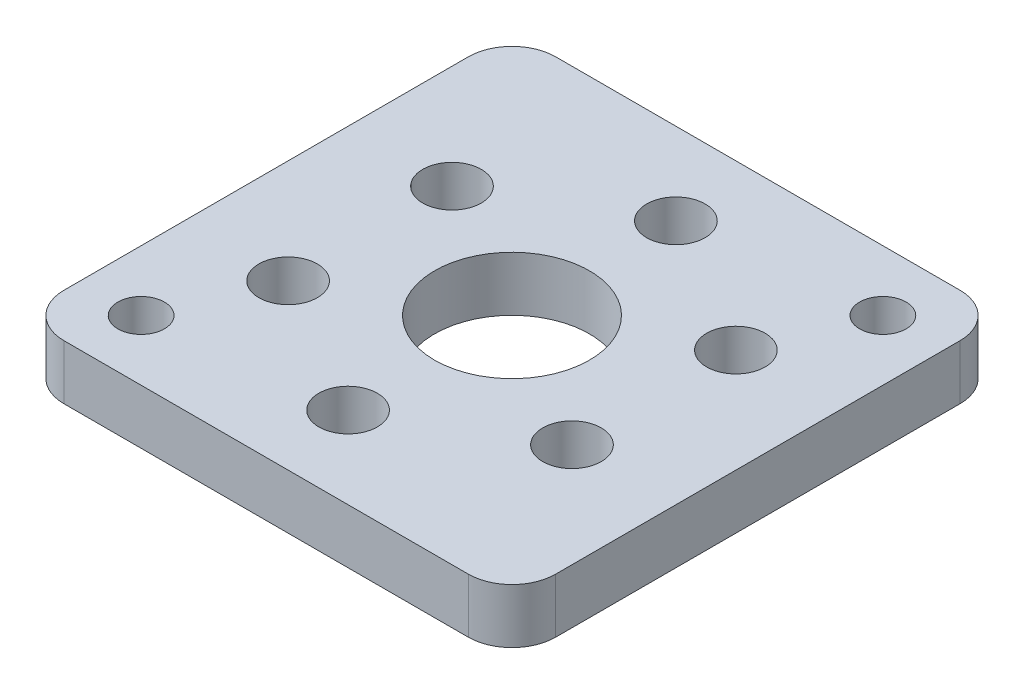
ISO-10303-21;
HEADER;
FILE_DESCRIPTION(('STEP AP214'),'2;1');
FILE_NAME('part.step','',(''),(''),'','','');
FILE_SCHEMA(('AUTOMOTIVE_DESIGN { 1 0 10303 214 1 1 1 1 }'));
ENDSEC;
DATA;
#1=APPLICATION_CONTEXT('core data for automotive mechanical design processes');
#2=APPLICATION_PROTOCOL_DEFINITION('international standard','automotive_design',2000,#1);
#3=PRODUCT_CONTEXT('',#1,'mechanical');
#4=PRODUCT('Part','Part','',(#3));
#5=PRODUCT_RELATED_PRODUCT_CATEGORY('part','',(#4));
#6=PRODUCT_DEFINITION_FORMATION('','',#4);
#7=PRODUCT_DEFINITION_CONTEXT('part definition',#1,'design');
#8=PRODUCT_DEFINITION('design','',#6,#7);
#9=PRODUCT_DEFINITION_SHAPE('','',#8);
#10=(LENGTH_UNIT() NAMED_UNIT(*) SI_UNIT(.MILLI.,.METRE.));
#11=(NAMED_UNIT(*) PLANE_ANGLE_UNIT() SI_UNIT($,.RADIAN.));
#12=(NAMED_UNIT(*) SI_UNIT($,.STERADIAN.) SOLID_ANGLE_UNIT());
#13=UNCERTAINTY_MEASURE_WITH_UNIT(LENGTH_MEASURE(1.E-05),#10,'distance_accuracy_value','');
#14=(GEOMETRIC_REPRESENTATION_CONTEXT(3) GLOBAL_UNCERTAINTY_ASSIGNED_CONTEXT((#13)) GLOBAL_UNIT_ASSIGNED_CONTEXT((#10,
#11,#12)) REPRESENTATION_CONTEXT('',''));
#15=CARTESIAN_POINT('',(0.,0.,0.));
#16=DIRECTION('',(0.,0.,1.));
#17=DIRECTION('',(1.,0.,0.));
#18=AXIS2_PLACEMENT_3D('',#15,#16,#17);
#19=CARTESIAN_POINT('',(0.,3.175,0.));
#20=DIRECTION('',(0.,-1.,0.));
#21=DIRECTION('',(0.,0.,-1.));
#22=AXIS2_PLACEMENT_3D('',#19,#20,#21);
#23=PLANE('',#22);
#24=CARTESIAN_POINT('',(10.776307345283,3.175,-10.776307345283));
#25=DIRECTION('',(0.,1.,0.));
#26=DIRECTION('',(0.,0.,1.));
#27=AXIS2_PLACEMENT_3D('',#24,#25,#26);
#28=CIRCLE('',#27,1.35255);
#29=CARTESIAN_POINT('',(10.776307345283,3.175,-9.42375734528301));
#30=VERTEX_POINT('',#29);
#31=EDGE_CURVE('E240',#30,#30,#28,.T.);
#32=ORIENTED_EDGE('',*,*,#31,.F.);
#33=EDGE_LOOP('',(#32));
#34=FACE_BOUND('',#33,.T.);
#35=CARTESIAN_POINT('',(-10.776307345283,3.175,10.776307345283));
#36=DIRECTION('',(0.,1.,0.));
#37=DIRECTION('',(0.,0.,1.));
#38=AXIS2_PLACEMENT_3D('',#35,#36,#37);
#39=CIRCLE('',#38,1.35255);
#40=CARTESIAN_POINT('',(-10.776307345283,3.175,12.128857345283));
#41=VERTEX_POINT('',#40);
#42=EDGE_CURVE('E234',#41,#41,#39,.T.);
#43=ORIENTED_EDGE('',*,*,#42,.F.);
#44=EDGE_LOOP('',(#43));
#45=FACE_BOUND('',#44,.T.);
#46=CARTESIAN_POINT('',(8.24889197104672,3.175,-4.7625000000001));
#47=DIRECTION('',(0.,1.,0.));
#48=DIRECTION('',(0.,0.,1.));
#49=AXIS2_PLACEMENT_3D('',#46,#47,#48);
#50=CIRCLE('',#49,1.7);
#51=CARTESIAN_POINT('',(8.24889197104672,3.175,-3.0625000000001));
#52=VERTEX_POINT('',#51);
#53=EDGE_CURVE('E228',#52,#52,#50,.T.);
#54=ORIENTED_EDGE('',*,*,#53,.F.);
#55=EDGE_LOOP('',(#54));
#56=FACE_BOUND('',#55,.T.);
#57=CARTESIAN_POINT('',(8.24889197104682,3.175,4.76249999999992));
#58=DIRECTION('',(0.,1.,0.));
#59=DIRECTION('',(0.,0.,1.));
#60=AXIS2_PLACEMENT_3D('',#57,#58,#59);
#61=CIRCLE('',#60,1.7);
#62=CARTESIAN_POINT('',(8.24889197104682,3.175,6.46249999999992));
#63=VERTEX_POINT('',#62);
#64=EDGE_CURVE('E222',#63,#63,#61,.T.);
#65=ORIENTED_EDGE('',*,*,#64,.F.);
#66=EDGE_LOOP('',(#65));
#67=FACE_BOUND('',#66,.T.);
#68=CARTESIAN_POINT('',(0.,3.175,9.525));
#69=DIRECTION('',(0.,1.,0.));
#70=DIRECTION('',(0.,0.,1.));
#71=AXIS2_PLACEMENT_3D('',#68,#69,#70);
#72=CIRCLE('',#71,1.7);
#73=CARTESIAN_POINT('',(0.,3.175,11.225));
#74=VERTEX_POINT('',#73);
#75=EDGE_CURVE('E216',#74,#74,#72,.T.);
#76=ORIENTED_EDGE('',*,*,#75,.F.);
#77=EDGE_LOOP('',(#76));
#78=FACE_BOUND('',#77,.T.);
#79=CARTESIAN_POINT('',(-8.24889197104679,3.175,-4.76249999999998));
#80=DIRECTION('',(0.,1.,0.));
#81=DIRECTION('',(0.,0.,1.));
#82=AXIS2_PLACEMENT_3D('',#79,#80,#81);
#83=CIRCLE('',#82,1.7);
#84=CARTESIAN_POINT('',(-8.24889197104679,3.175,-3.06249999999998));
#85=VERTEX_POINT('',#84);
#86=EDGE_CURVE('E204',#85,#85,#83,.T.);
#87=ORIENTED_EDGE('',*,*,#86,.F.);
#88=EDGE_LOOP('',(#87));
#89=FACE_BOUND('',#88,.T.);
#90=CARTESIAN_POINT('',(0.,3.175,0.));
#91=DIRECTION('',(0.,1.,0.));
#92=DIRECTION('',(0.,0.,1.));
#93=AXIS2_PLACEMENT_3D('',#90,#91,#92);
#94=CIRCLE('',#93,4.5);
#95=CARTESIAN_POINT('',(0.,3.175,4.5));
#96=VERTEX_POINT('',#95);
#97=EDGE_CURVE('E196',#96,#96,#94,.T.);
#98=ORIENTED_EDGE('',*,*,#97,.F.);
#99=EDGE_LOOP('',(#98));
#100=FACE_BOUND('',#99,.T.);
#101=CARTESIAN_POINT('',(0.,3.175,-9.525));
#102=DIRECTION('',(0.,1.,0.));
#103=DIRECTION('',(0.,0.,1.));
#104=AXIS2_PLACEMENT_3D('',#101,#102,#103);
#105=CIRCLE('',#104,1.7);
#106=CARTESIAN_POINT('',(0.,3.175,-7.825));
#107=VERTEX_POINT('',#106);
#108=EDGE_CURVE('E192',#107,#107,#105,.T.);
#109=ORIENTED_EDGE('',*,*,#108,.F.);
#110=EDGE_LOOP('',(#109));
#111=FACE_BOUND('',#110,.T.);
#112=DIRECTION('',(0.,0.,-1.));
#113=VECTOR('',#112,1.);
#114=CARTESIAN_POINT('',(14.2875,3.175,14.2875));
#115=LINE('',#114,#113);
#116=CARTESIAN_POINT('',(14.2875,3.175,11.7475));
#117=VERTEX_POINT('',#116);
#118=CARTESIAN_POINT('',(14.2875,3.175,-11.7475));
#119=VERTEX_POINT('',#118);
#120=EDGE_CURVE('E147',#117,#119,#115,.T.);
#121=ORIENTED_EDGE('',*,*,#120,.T.);
#122=CARTESIAN_POINT('',(11.7475,3.175,-11.7475));
#123=DIRECTION('',(0.,-1.,0.));
#124=DIRECTION('',(0.,0.,-1.));
#125=AXIS2_PLACEMENT_3D('',#122,#123,#124);
#126=CIRCLE('',#125,2.54);
#127=CARTESIAN_POINT('',(11.7475,3.175,-14.2875));
#128=VERTEX_POINT('',#127);
#129=EDGE_CURVE('E161',#119,#128,#126,.F.);
#130=ORIENTED_EDGE('',*,*,#129,.T.);
#131=DIRECTION('',(-1.,0.,0.));
#132=VECTOR('',#131,1.);
#133=CARTESIAN_POINT('',(-14.2875,3.175,-14.2875));
#134=LINE('',#133,#132);
#135=CARTESIAN_POINT('',(-11.7475,3.175,-14.2875));
#136=VERTEX_POINT('',#135);
#137=EDGE_CURVE('E128',#128,#136,#134,.T.);
#138=ORIENTED_EDGE('',*,*,#137,.T.);
#139=CARTESIAN_POINT('',(-11.7475,3.175,-11.7475));
#140=DIRECTION('',(0.,-1.,0.));
#141=DIRECTION('',(0.,0.,-1.));
#142=AXIS2_PLACEMENT_3D('',#139,#140,#141);
#143=CIRCLE('',#142,2.54);
#144=CARTESIAN_POINT('',(-14.2875,3.175,-11.7475));
#145=VERTEX_POINT('',#144);
#146=EDGE_CURVE('E157',#136,#145,#143,.F.);
#147=ORIENTED_EDGE('',*,*,#146,.T.);
#148=DIRECTION('',(0.,0.,1.));
#149=VECTOR('',#148,1.);
#150=CARTESIAN_POINT('',(-14.2875,3.175,14.2875));
#151=LINE('',#150,#149);
#152=CARTESIAN_POINT('',(-14.2875,3.175,11.7475));
#153=VERTEX_POINT('',#152);
#154=EDGE_CURVE('E170',#145,#153,#151,.T.);
#155=ORIENTED_EDGE('',*,*,#154,.T.);
#156=CARTESIAN_POINT('',(-11.7475,3.175,11.7475));
#157=DIRECTION('',(0.,-1.,0.));
#158=DIRECTION('',(0.,0.,-1.));
#159=AXIS2_PLACEMENT_3D('',#156,#157,#158);
#160=CIRCLE('',#159,2.54);
#161=CARTESIAN_POINT('',(-11.7475,3.175,14.2875));
#162=VERTEX_POINT('',#161);
#163=EDGE_CURVE('E63',#153,#162,#160,.F.);
#164=ORIENTED_EDGE('',*,*,#163,.T.);
#165=DIRECTION('',(1.,0.,0.));
#166=VECTOR('',#165,1.);
#167=CARTESIAN_POINT('',(-14.2875,3.175,14.2875));
#168=LINE('',#167,#166);
#169=CARTESIAN_POINT('',(11.7475,3.175,14.2875));
#170=VERTEX_POINT('',#169);
#171=EDGE_CURVE('E148',#162,#170,#168,.T.);
#172=ORIENTED_EDGE('',*,*,#171,.T.);
#173=CARTESIAN_POINT('',(11.7475,3.175,11.7475));
#174=DIRECTION('',(0.,-1.,0.));
#175=DIRECTION('',(0.,0.,-1.));
#176=AXIS2_PLACEMENT_3D('',#173,#174,#175);
#177=CIRCLE('',#176,2.54);
#178=EDGE_CURVE('E159',#170,#117,#177,.F.);
#179=ORIENTED_EDGE('',*,*,#178,.T.);
#180=EDGE_LOOP('',(#121,#130,#138,#147,#155,#164,#172,#179));
#181=FACE_BOUND('',#180,.T.);
#182=CARTESIAN_POINT('',(-8.24889197104676,3.175,4.76250000000004));
#183=DIRECTION('',(0.,1.,0.));
#184=DIRECTION('',(0.,0.,1.));
#185=AXIS2_PLACEMENT_3D('',#182,#183,#184);
#186=CIRCLE('',#185,1.7);
#187=CARTESIAN_POINT('',(-8.24889197104676,3.175,6.46250000000004));
#188=VERTEX_POINT('',#187);
#189=EDGE_CURVE('E210',#188,#188,#186,.T.);
#190=ORIENTED_EDGE('',*,*,#189,.F.);
#191=EDGE_LOOP('',(#190));
#192=FACE_BOUND('',#191,.T.);
#193=ADVANCED_FACE('F41',(#34,#45,#56,#67,#78,#89,#100,#111,#181,#192),#23,.F.);
#194=CARTESIAN_POINT('',(0.,0.,0.));
#195=DIRECTION('',(0.,-1.,0.));
#196=DIRECTION('',(0.,0.,-1.));
#197=AXIS2_PLACEMENT_3D('',#194,#195,#196);
#198=PLANE('',#197);
#199=CARTESIAN_POINT('',(10.776307345283,0.,-10.776307345283));
#200=DIRECTION('',(0.,1.,0.));
#201=DIRECTION('',(0.,0.,1.));
#202=AXIS2_PLACEMENT_3D('',#199,#200,#201);
#203=CIRCLE('',#202,1.35255);
#204=CARTESIAN_POINT('',(10.776307345283,0.,-9.42375734528301));
#205=VERTEX_POINT('',#204);
#206=EDGE_CURVE('E237',#205,#205,#203,.T.);
#207=ORIENTED_EDGE('',*,*,#206,.T.);
#208=EDGE_LOOP('',(#207));
#209=FACE_BOUND('',#208,.T.);
#210=CARTESIAN_POINT('',(-10.776307345283,0.,10.776307345283));
#211=DIRECTION('',(0.,1.,0.));
#212=DIRECTION('',(0.,0.,1.));
#213=AXIS2_PLACEMENT_3D('',#210,#211,#212);
#214=CIRCLE('',#213,1.35255);
#215=CARTESIAN_POINT('',(-10.776307345283,0.,12.128857345283));
#216=VERTEX_POINT('',#215);
#217=EDGE_CURVE('E231',#216,#216,#214,.T.);
#218=ORIENTED_EDGE('',*,*,#217,.T.);
#219=EDGE_LOOP('',(#218));
#220=FACE_BOUND('',#219,.T.);
#221=CARTESIAN_POINT('',(8.24889197104672,0.,-4.7625000000001));
#222=DIRECTION('',(0.,1.,0.));
#223=DIRECTION('',(0.,0.,1.));
#224=AXIS2_PLACEMENT_3D('',#221,#222,#223);
#225=CIRCLE('',#224,1.7);
#226=CARTESIAN_POINT('',(8.24889197104672,0.,-3.0625000000001));
#227=VERTEX_POINT('',#226);
#228=EDGE_CURVE('E225',#227,#227,#225,.T.);
#229=ORIENTED_EDGE('',*,*,#228,.T.);
#230=EDGE_LOOP('',(#229));
#231=FACE_BOUND('',#230,.T.);
#232=CARTESIAN_POINT('',(8.24889197104682,0.,4.76249999999992));
#233=DIRECTION('',(0.,1.,0.));
#234=DIRECTION('',(0.,0.,1.));
#235=AXIS2_PLACEMENT_3D('',#232,#233,#234);
#236=CIRCLE('',#235,1.7);
#237=CARTESIAN_POINT('',(8.24889197104682,0.,6.46249999999992));
#238=VERTEX_POINT('',#237);
#239=EDGE_CURVE('E219',#238,#238,#236,.T.);
#240=ORIENTED_EDGE('',*,*,#239,.T.);
#241=EDGE_LOOP('',(#240));
#242=FACE_BOUND('',#241,.T.);
#243=CARTESIAN_POINT('',(0.,0.,9.525));
#244=DIRECTION('',(0.,1.,0.));
#245=DIRECTION('',(0.,0.,1.));
#246=AXIS2_PLACEMENT_3D('',#243,#244,#245);
#247=CIRCLE('',#246,1.7);
#248=CARTESIAN_POINT('',(0.,0.,11.225));
#249=VERTEX_POINT('',#248);
#250=EDGE_CURVE('E213',#249,#249,#247,.T.);
#251=ORIENTED_EDGE('',*,*,#250,.T.);
#252=EDGE_LOOP('',(#251));
#253=FACE_BOUND('',#252,.T.);
#254=CARTESIAN_POINT('',(-8.24889197104676,0.,4.76250000000004));
#255=DIRECTION('',(0.,1.,0.));
#256=DIRECTION('',(0.,0.,1.));
#257=AXIS2_PLACEMENT_3D('',#254,#255,#256);
#258=CIRCLE('',#257,1.7);
#259=CARTESIAN_POINT('',(-8.24889197104676,0.,6.46250000000004));
#260=VERTEX_POINT('',#259);
#261=EDGE_CURVE('E207',#260,#260,#258,.T.);
#262=ORIENTED_EDGE('',*,*,#261,.T.);
#263=EDGE_LOOP('',(#262));
#264=FACE_BOUND('',#263,.T.);
#265=CARTESIAN_POINT('',(-8.24889197104679,0.,-4.76249999999998));
#266=DIRECTION('',(0.,1.,0.));
#267=DIRECTION('',(0.,0.,1.));
#268=AXIS2_PLACEMENT_3D('',#265,#266,#267);
#269=CIRCLE('',#268,1.7);
#270=CARTESIAN_POINT('',(-8.24889197104679,0.,-3.06249999999998));
#271=VERTEX_POINT('',#270);
#272=EDGE_CURVE('E199',#271,#271,#269,.T.);
#273=ORIENTED_EDGE('',*,*,#272,.T.);
#274=EDGE_LOOP('',(#273));
#275=FACE_BOUND('',#274,.T.);
#276=CARTESIAN_POINT('',(0.,0.,0.));
#277=DIRECTION('',(0.,1.,0.));
#278=DIRECTION('',(0.,0.,1.));
#279=AXIS2_PLACEMENT_3D('',#276,#277,#278);
#280=CIRCLE('',#279,4.5);
#281=CARTESIAN_POINT('',(0.,0.,4.5));
#282=VERTEX_POINT('',#281);
#283=EDGE_CURVE('E195',#282,#282,#280,.T.);
#284=ORIENTED_EDGE('',*,*,#283,.T.);
#285=EDGE_LOOP('',(#284));
#286=FACE_BOUND('',#285,.T.);
#287=DIRECTION('',(-1.,0.,0.));
#288=VECTOR('',#287,1.);
#289=CARTESIAN_POINT('',(-14.2875,0.,-14.2875));
#290=LINE('',#289,#288);
#291=CARTESIAN_POINT('',(11.7475,0.,-14.2875));
#292=VERTEX_POINT('',#291);
#293=CARTESIAN_POINT('',(-11.7475,0.,-14.2875));
#294=VERTEX_POINT('',#293);
#295=EDGE_CURVE('E125',#292,#294,#290,.T.);
#296=ORIENTED_EDGE('',*,*,#295,.F.);
#297=CARTESIAN_POINT('',(11.7475,0.,-11.7475));
#298=DIRECTION('',(0.,-1.,0.));
#299=DIRECTION('',(0.,0.,-1.));
#300=AXIS2_PLACEMENT_3D('',#297,#298,#299);
#301=CIRCLE('',#300,2.54);
#302=CARTESIAN_POINT('',(14.2875,0.,-11.7475));
#303=VERTEX_POINT('',#302);
#304=EDGE_CURVE('E108',#292,#303,#301,.T.);
#305=ORIENTED_EDGE('',*,*,#304,.T.);
#306=DIRECTION('',(0.,0.,-1.));
#307=VECTOR('',#306,1.);
#308=CARTESIAN_POINT('',(14.2875,0.,14.2875));
#309=LINE('',#308,#307);
#310=CARTESIAN_POINT('',(14.2875,0.,11.7475));
#311=VERTEX_POINT('',#310);
#312=EDGE_CURVE('E137',#311,#303,#309,.T.);
#313=ORIENTED_EDGE('',*,*,#312,.F.);
#314=CARTESIAN_POINT('',(11.7475,0.,11.7475));
#315=DIRECTION('',(0.,-1.,0.));
#316=DIRECTION('',(0.,0.,-1.));
#317=AXIS2_PLACEMENT_3D('',#314,#315,#316);
#318=CIRCLE('',#317,2.54);
#319=CARTESIAN_POINT('',(11.7475,0.,14.2875));
#320=VERTEX_POINT('',#319);
#321=EDGE_CURVE('E119',#311,#320,#318,.T.);
#322=ORIENTED_EDGE('',*,*,#321,.T.);
#323=DIRECTION('',(1.,0.,0.));
#324=VECTOR('',#323,1.);
#325=CARTESIAN_POINT('',(-14.2875,0.,14.2875));
#326=LINE('',#325,#324);
#327=CARTESIAN_POINT('',(-11.7475,0.,14.2875));
#328=VERTEX_POINT('',#327);
#329=EDGE_CURVE('E140',#328,#320,#326,.T.);
#330=ORIENTED_EDGE('',*,*,#329,.F.);
#331=CARTESIAN_POINT('',(-11.7475,0.,11.7475));
#332=DIRECTION('',(0.,-1.,0.));
#333=DIRECTION('',(0.,0.,-1.));
#334=AXIS2_PLACEMENT_3D('',#331,#332,#333);
#335=CIRCLE('',#334,2.54);
#336=CARTESIAN_POINT('',(-14.2875,0.,11.7475));
#337=VERTEX_POINT('',#336);
#338=EDGE_CURVE('E129',#328,#337,#335,.T.);
#339=ORIENTED_EDGE('',*,*,#338,.T.);
#340=DIRECTION('',(0.,0.,1.));
#341=VECTOR('',#340,1.);
#342=CARTESIAN_POINT('',(-14.2875,0.,14.2875));
#343=LINE('',#342,#341);
#344=CARTESIAN_POINT('',(-14.2875,0.,-11.7475));
#345=VERTEX_POINT('',#344);
#346=EDGE_CURVE('E136',#345,#337,#343,.T.);
#347=ORIENTED_EDGE('',*,*,#346,.F.);
#348=CARTESIAN_POINT('',(-11.7475,0.,-11.7475));
#349=DIRECTION('',(0.,-1.,0.));
#350=DIRECTION('',(0.,0.,-1.));
#351=AXIS2_PLACEMENT_3D('',#348,#349,#350);
#352=CIRCLE('',#351,2.54);
#353=EDGE_CURVE('E135',#345,#294,#352,.T.);
#354=ORIENTED_EDGE('',*,*,#353,.T.);
#355=EDGE_LOOP('',(#296,#305,#313,#322,#330,#339,#347,#354));
#356=FACE_BOUND('',#355,.T.);
#357=CARTESIAN_POINT('',(0.,0.,-9.525));
#358=DIRECTION('',(0.,1.,0.));
#359=DIRECTION('',(0.,0.,1.));
#360=AXIS2_PLACEMENT_3D('',#357,#358,#359);
#361=CIRCLE('',#360,1.7);
#362=CARTESIAN_POINT('',(0.,0.,-7.825));
#363=VERTEX_POINT('',#362);
#364=EDGE_CURVE('E142',#363,#363,#361,.T.);
#365=ORIENTED_EDGE('',*,*,#364,.T.);
#366=EDGE_LOOP('',(#365));
#367=FACE_BOUND('',#366,.T.);
#368=ADVANCED_FACE('F132',(#209,#220,#231,#242,#253,#264,#275,#286,#356,#367),#198,.T.);
#369=CARTESIAN_POINT('',(14.2875,3.175,14.2875));
#370=DIRECTION('',(-1.,0.,0.));
#371=DIRECTION('',(0.,0.,1.));
#372=AXIS2_PLACEMENT_3D('',#369,#370,#371);
#373=PLANE('',#372);
#374=ORIENTED_EDGE('',*,*,#312,.T.);
#375=DIRECTION('',(0.,-1.,0.));
#376=VECTOR('',#375,1.);
#377=CARTESIAN_POINT('',(14.2875,3.175,-11.7475));
#378=LINE('',#377,#376);
#379=EDGE_CURVE('E113',#303,#119,#378,.F.);
#380=ORIENTED_EDGE('',*,*,#379,.T.);
#381=ORIENTED_EDGE('',*,*,#120,.F.);
#382=DIRECTION('',(0.,-1.,0.));
#383=VECTOR('',#382,1.);
#384=CARTESIAN_POINT('',(14.2875,3.175,11.7475));
#385=LINE('',#384,#383);
#386=EDGE_CURVE('E118',#117,#311,#385,.T.);
#387=ORIENTED_EDGE('',*,*,#386,.T.);
#388=EDGE_LOOP('',(#374,#380,#381,#387));
#389=FACE_BOUND('',#388,.T.);
#390=ADVANCED_FACE('F186',(#389),#373,.F.);
#391=CARTESIAN_POINT('',(-14.2875,3.175,-14.2875));
#392=DIRECTION('',(0.,0.,1.));
#393=DIRECTION('',(1.,0.,0.));
#394=AXIS2_PLACEMENT_3D('',#391,#392,#393);
#395=PLANE('',#394);
#396=ORIENTED_EDGE('',*,*,#137,.F.);
#397=DIRECTION('',(0.,-1.,0.));
#398=VECTOR('',#397,1.);
#399=CARTESIAN_POINT('',(11.7475,3.175,-14.2875));
#400=LINE('',#399,#398);
#401=EDGE_CURVE('E112',#128,#292,#400,.T.);
#402=ORIENTED_EDGE('',*,*,#401,.T.);
#403=ORIENTED_EDGE('',*,*,#295,.T.);
#404=DIRECTION('',(0.,-1.,0.));
#405=VECTOR('',#404,1.);
#406=CARTESIAN_POINT('',(-11.7475,3.175,-14.2875));
#407=LINE('',#406,#405);
#408=EDGE_CURVE('E130',#294,#136,#407,.F.);
#409=ORIENTED_EDGE('',*,*,#408,.T.);
#410=EDGE_LOOP('',(#396,#402,#403,#409));
#411=FACE_BOUND('',#410,.T.);
#412=ADVANCED_FACE('F124',(#411),#395,.F.);
#413=CARTESIAN_POINT('',(-14.2875,3.175,14.2875));
#414=DIRECTION('',(1.,0.,0.));
#415=DIRECTION('',(0.,0.,-1.));
#416=AXIS2_PLACEMENT_3D('',#413,#414,#415);
#417=PLANE('',#416);
#418=ORIENTED_EDGE('',*,*,#154,.F.);
#419=DIRECTION('',(0.,-1.,0.));
#420=VECTOR('',#419,1.);
#421=CARTESIAN_POINT('',(-14.2875,3.175,-11.7475));
#422=LINE('',#421,#420);
#423=EDGE_CURVE('E11',#145,#345,#422,.T.);
#424=ORIENTED_EDGE('',*,*,#423,.T.);
#425=ORIENTED_EDGE('',*,*,#346,.T.);
#426=DIRECTION('',(0.,-1.,0.));
#427=VECTOR('',#426,1.);
#428=CARTESIAN_POINT('',(-14.2875,3.175,11.7475));
#429=LINE('',#428,#427);
#430=EDGE_CURVE('E49',#337,#153,#429,.F.);
#431=ORIENTED_EDGE('',*,*,#430,.T.);
#432=EDGE_LOOP('',(#418,#424,#425,#431));
#433=FACE_BOUND('',#432,.T.);
#434=ADVANCED_FACE('F169',(#433),#417,.F.);
#435=CARTESIAN_POINT('',(-14.2875,3.175,14.2875));
#436=DIRECTION('',(0.,0.,-1.));
#437=DIRECTION('',(-1.,0.,0.));
#438=AXIS2_PLACEMENT_3D('',#435,#436,#437);
#439=PLANE('',#438);
#440=ORIENTED_EDGE('',*,*,#329,.T.);
#441=DIRECTION('',(0.,-1.,0.));
#442=VECTOR('',#441,1.);
#443=CARTESIAN_POINT('',(11.7475,3.175,14.2875));
#444=LINE('',#443,#442);
#445=EDGE_CURVE('E56',#320,#170,#444,.F.);
#446=ORIENTED_EDGE('',*,*,#445,.T.);
#447=ORIENTED_EDGE('',*,*,#171,.F.);
#448=DIRECTION('',(0.,-1.,0.));
#449=VECTOR('',#448,1.);
#450=CARTESIAN_POINT('',(-11.7475,3.175,14.2875));
#451=LINE('',#450,#449);
#452=EDGE_CURVE('E163',#162,#328,#451,.T.);
#453=ORIENTED_EDGE('',*,*,#452,.T.);
#454=EDGE_LOOP('',(#440,#446,#447,#453));
#455=FACE_BOUND('',#454,.T.);
#456=ADVANCED_FACE('F179',(#455),#439,.F.);
#457=CARTESIAN_POINT('',(0.,3.175,-9.525));
#458=DIRECTION('',(0.,1.,0.));
#459=DIRECTION('',(0.,0.,1.));
#460=AXIS2_PLACEMENT_3D('',#457,#458,#459);
#461=CYLINDRICAL_SURFACE('',#460,1.7);
#462=ORIENTED_EDGE('',*,*,#364,.F.);
#463=EDGE_LOOP('',(#462));
#464=FACE_BOUND('',#463,.T.);
#465=ORIENTED_EDGE('',*,*,#108,.T.);
#466=EDGE_LOOP('',(#465));
#467=FACE_BOUND('',#466,.T.);
#468=ADVANCED_FACE('F263',(#464,#467),#461,.F.);
#469=CARTESIAN_POINT('',(0.,0.,0.));
#470=DIRECTION('',(0.,1.,0.));
#471=DIRECTION('',(0.,0.,1.));
#472=AXIS2_PLACEMENT_3D('',#469,#470,#471);
#473=CYLINDRICAL_SURFACE('',#472,4.5);
#474=ORIENTED_EDGE('',*,*,#283,.F.);
#475=EDGE_LOOP('',(#474));
#476=FACE_BOUND('',#475,.T.);
#477=ORIENTED_EDGE('',*,*,#97,.T.);
#478=EDGE_LOOP('',(#477));
#479=FACE_BOUND('',#478,.T.);
#480=ADVANCED_FACE('F265',(#476,#479),#473,.F.);
#481=CARTESIAN_POINT('',(-8.24889197104679,3.175,-4.76249999999998));
#482=DIRECTION('',(0.,1.,0.));
#483=DIRECTION('',(0.,0.,1.));
#484=AXIS2_PLACEMENT_3D('',#481,#482,#483);
#485=CYLINDRICAL_SURFACE('',#484,1.7);
#486=ORIENTED_EDGE('',*,*,#272,.F.);
#487=EDGE_LOOP('',(#486));
#488=FACE_BOUND('',#487,.T.);
#489=ORIENTED_EDGE('',*,*,#86,.T.);
#490=EDGE_LOOP('',(#489));
#491=FACE_BOUND('',#490,.T.);
#492=ADVANCED_FACE('F272',(#488,#491),#485,.F.);
#493=CARTESIAN_POINT('',(-8.24889197104676,3.175,4.76250000000004));
#494=DIRECTION('',(0.,1.,0.));
#495=DIRECTION('',(0.,0.,1.));
#496=AXIS2_PLACEMENT_3D('',#493,#494,#495);
#497=CYLINDRICAL_SURFACE('',#496,1.7);
#498=ORIENTED_EDGE('',*,*,#261,.F.);
#499=EDGE_LOOP('',(#498));
#500=FACE_BOUND('',#499,.T.);
#501=ORIENTED_EDGE('',*,*,#189,.T.);
#502=EDGE_LOOP('',(#501));
#503=FACE_BOUND('',#502,.T.);
#504=ADVANCED_FACE('F406',(#500,#503),#497,.F.);
#505=CARTESIAN_POINT('',(0.,3.175,9.525));
#506=DIRECTION('',(0.,1.,0.));
#507=DIRECTION('',(0.,0.,1.));
#508=AXIS2_PLACEMENT_3D('',#505,#506,#507);
#509=CYLINDRICAL_SURFACE('',#508,1.7);
#510=ORIENTED_EDGE('',*,*,#250,.F.);
#511=EDGE_LOOP('',(#510));
#512=FACE_BOUND('',#511,.T.);
#513=ORIENTED_EDGE('',*,*,#75,.T.);
#514=EDGE_LOOP('',(#513));
#515=FACE_BOUND('',#514,.T.);
#516=ADVANCED_FACE('F396',(#512,#515),#509,.F.);
#517=CARTESIAN_POINT('',(8.24889197104682,3.175,4.76249999999992));
#518=DIRECTION('',(0.,1.,0.));
#519=DIRECTION('',(0.,0.,1.));
#520=AXIS2_PLACEMENT_3D('',#517,#518,#519);
#521=CYLINDRICAL_SURFACE('',#520,1.7);
#522=ORIENTED_EDGE('',*,*,#239,.F.);
#523=EDGE_LOOP('',(#522));
#524=FACE_BOUND('',#523,.T.);
#525=ORIENTED_EDGE('',*,*,#64,.T.);
#526=EDGE_LOOP('',(#525));
#527=FACE_BOUND('',#526,.T.);
#528=ADVANCED_FACE('F386',(#524,#527),#521,.F.);
#529=CARTESIAN_POINT('',(8.24889197104672,3.175,-4.7625000000001));
#530=DIRECTION('',(0.,1.,0.));
#531=DIRECTION('',(0.,0.,1.));
#532=AXIS2_PLACEMENT_3D('',#529,#530,#531);
#533=CYLINDRICAL_SURFACE('',#532,1.7);
#534=ORIENTED_EDGE('',*,*,#228,.F.);
#535=EDGE_LOOP('',(#534));
#536=FACE_BOUND('',#535,.T.);
#537=ORIENTED_EDGE('',*,*,#53,.T.);
#538=EDGE_LOOP('',(#537));
#539=FACE_BOUND('',#538,.T.);
#540=ADVANCED_FACE('F375',(#536,#539),#533,.F.);
#541=CARTESIAN_POINT('',(-10.776307345283,3.175,10.776307345283));
#542=DIRECTION('',(0.,1.,0.));
#543=DIRECTION('',(0.,0.,1.));
#544=AXIS2_PLACEMENT_3D('',#541,#542,#543);
#545=CYLINDRICAL_SURFACE('',#544,1.35255);
#546=ORIENTED_EDGE('',*,*,#217,.F.);
#547=EDGE_LOOP('',(#546));
#548=FACE_BOUND('',#547,.T.);
#549=ORIENTED_EDGE('',*,*,#42,.T.);
#550=EDGE_LOOP('',(#549));
#551=FACE_BOUND('',#550,.T.);
#552=ADVANCED_FACE('F364',(#548,#551),#545,.F.);
#553=CARTESIAN_POINT('',(10.776307345283,3.175,-10.776307345283));
#554=DIRECTION('',(0.,1.,0.));
#555=DIRECTION('',(0.,0.,1.));
#556=AXIS2_PLACEMENT_3D('',#553,#554,#555);
#557=CYLINDRICAL_SURFACE('',#556,1.35255);
#558=ORIENTED_EDGE('',*,*,#206,.F.);
#559=EDGE_LOOP('',(#558));
#560=FACE_BOUND('',#559,.T.);
#561=ORIENTED_EDGE('',*,*,#31,.T.);
#562=EDGE_LOOP('',(#561));
#563=FACE_BOUND('',#562,.T.);
#564=ADVANCED_FACE('F244',(#560,#563),#557,.F.);
#565=CARTESIAN_POINT('',(11.7475,3.175,-11.7475));
#566=DIRECTION('',(0.,-1.,0.));
#567=DIRECTION('',(0.,0.,-1.));
#568=AXIS2_PLACEMENT_3D('',#565,#566,#567);
#569=CYLINDRICAL_SURFACE('',#568,2.54);
#570=ORIENTED_EDGE('',*,*,#129,.F.);
#571=ORIENTED_EDGE('',*,*,#379,.F.);
#572=ORIENTED_EDGE('',*,*,#304,.F.);
#573=ORIENTED_EDGE('',*,*,#401,.F.);
#574=EDGE_LOOP('',(#570,#571,#572,#573));
#575=FACE_BOUND('',#574,.T.);
#576=ADVANCED_FACE('F111',(#575),#569,.T.);
#577=CARTESIAN_POINT('',(11.7475,3.175,11.7475));
#578=DIRECTION('',(0.,-1.,0.));
#579=DIRECTION('',(0.,0.,-1.));
#580=AXIS2_PLACEMENT_3D('',#577,#578,#579);
#581=CYLINDRICAL_SURFACE('',#580,2.54);
#582=ORIENTED_EDGE('',*,*,#178,.F.);
#583=ORIENTED_EDGE('',*,*,#445,.F.);
#584=ORIENTED_EDGE('',*,*,#321,.F.);
#585=ORIENTED_EDGE('',*,*,#386,.F.);
#586=EDGE_LOOP('',(#582,#583,#584,#585));
#587=FACE_BOUND('',#586,.T.);
#588=ADVANCED_FACE('F183',(#587),#581,.T.);
#589=CARTESIAN_POINT('',(-11.7475,3.175,-11.7475));
#590=DIRECTION('',(0.,-1.,0.));
#591=DIRECTION('',(0.,0.,-1.));
#592=AXIS2_PLACEMENT_3D('',#589,#590,#591);
#593=CYLINDRICAL_SURFACE('',#592,2.54);
#594=ORIENTED_EDGE('',*,*,#146,.F.);
#595=ORIENTED_EDGE('',*,*,#408,.F.);
#596=ORIENTED_EDGE('',*,*,#353,.F.);
#597=ORIENTED_EDGE('',*,*,#423,.F.);
#598=EDGE_LOOP('',(#594,#595,#596,#597));
#599=FACE_BOUND('',#598,.T.);
#600=ADVANCED_FACE('F291',(#599),#593,.T.);
#601=CARTESIAN_POINT('',(-11.7475,3.175,11.7475));
#602=DIRECTION('',(0.,-1.,0.));
#603=DIRECTION('',(0.,0.,-1.));
#604=AXIS2_PLACEMENT_3D('',#601,#602,#603);
#605=CYLINDRICAL_SURFACE('',#604,2.54);
#606=ORIENTED_EDGE('',*,*,#163,.F.);
#607=ORIENTED_EDGE('',*,*,#430,.F.);
#608=ORIENTED_EDGE('',*,*,#338,.F.);
#609=ORIENTED_EDGE('',*,*,#452,.F.);
#610=EDGE_LOOP('',(#606,#607,#608,#609));
#611=FACE_BOUND('',#610,.T.);
#612=ADVANCED_FACE('F43',(#611),#605,.T.);
#613=CLOSED_SHELL('',(#193,#368,#390,#412,#434,#456,#468,#480,#492,#504,#516,#528,#540,#552,
#564,#576,#588,#600,#612));
#614=MANIFOLD_SOLID_BREP('B2',#613);
#615=ADVANCED_BREP_SHAPE_REPRESENTATION('',(#18,#614),#14);
#616=SHAPE_DEFINITION_REPRESENTATION(#9,#615);
ENDSEC;
END-ISO-10303-21;
